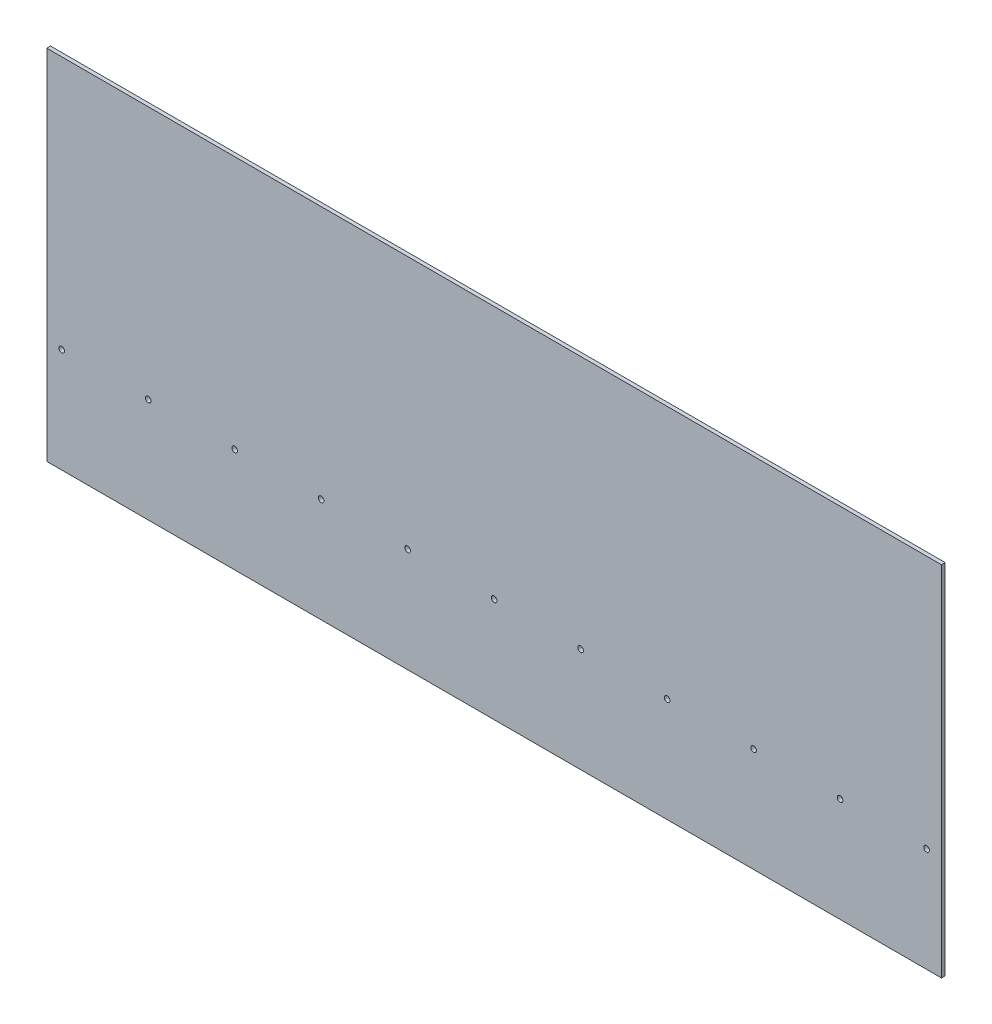
ISO-10303-21;
HEADER;
FILE_DESCRIPTION(('STEP AP214'),'2;1');
FILE_NAME('part.step','',(''),(''),'','','');
FILE_SCHEMA(('AUTOMOTIVE_DESIGN { 1 0 10303 214 1 1 1 1 }'));
ENDSEC;
DATA;
#1=APPLICATION_CONTEXT('core data for automotive mechanical design processes');
#2=APPLICATION_PROTOCOL_DEFINITION('international standard','automotive_design',2000,#1);
#3=PRODUCT_CONTEXT('',#1,'mechanical');
#4=PRODUCT('Part','Part','',(#3));
#5=PRODUCT_RELATED_PRODUCT_CATEGORY('part','',(#4));
#6=PRODUCT_DEFINITION_FORMATION('','',#4);
#7=PRODUCT_DEFINITION_CONTEXT('part definition',#1,'design');
#8=PRODUCT_DEFINITION('design','',#6,#7);
#9=PRODUCT_DEFINITION_SHAPE('','',#8);
#10=(LENGTH_UNIT() NAMED_UNIT(*) SI_UNIT(.MILLI.,.METRE.));
#11=(NAMED_UNIT(*) PLANE_ANGLE_UNIT() SI_UNIT($,.RADIAN.));
#12=(NAMED_UNIT(*) SI_UNIT($,.STERADIAN.) SOLID_ANGLE_UNIT());
#13=UNCERTAINTY_MEASURE_WITH_UNIT(LENGTH_MEASURE(1.E-05),#10,'distance_accuracy_value','');
#14=(GEOMETRIC_REPRESENTATION_CONTEXT(3) GLOBAL_UNCERTAINTY_ASSIGNED_CONTEXT((#13)) GLOBAL_UNIT_ASSIGNED_CONTEXT((#10,
#11,#12)) REPRESENTATION_CONTEXT('',''));
#15=CARTESIAN_POINT('',(0.,0.,0.));
#16=DIRECTION('',(0.,0.,1.));
#17=DIRECTION('',(1.,0.,0.));
#18=AXIS2_PLACEMENT_3D('',#15,#16,#17);
#19=CARTESIAN_POINT('',(381.,152.4,3.175));
#20=DIRECTION('',(-1.,0.,0.));
#21=DIRECTION('',(0.,0.,1.));
#22=AXIS2_PLACEMENT_3D('',#19,#20,#21);
#23=PLANE('',#22);
#24=DIRECTION('',(0.,1.,0.));
#25=VECTOR('',#24,1.);
#26=CARTESIAN_POINT('',(381.,152.4,0.));
#27=LINE('',#26,#25);
#28=CARTESIAN_POINT('',(381.,-152.4,0.));
#29=VERTEX_POINT('',#28);
#30=CARTESIAN_POINT('',(381.,152.4,0.));
#31=VERTEX_POINT('',#30);
#32=EDGE_CURVE('E100',#29,#31,#27,.T.);
#33=ORIENTED_EDGE('',*,*,#32,.T.);
#34=DIRECTION('',(0.,0.,-1.));
#35=VECTOR('',#34,1.);
#36=CARTESIAN_POINT('',(381.,152.4,3.175));
#37=LINE('',#36,#35);
#38=CARTESIAN_POINT('',(381.,152.4,3.175));
#39=VERTEX_POINT('',#38);
#40=EDGE_CURVE('E11',#39,#31,#37,.T.);
#41=ORIENTED_EDGE('',*,*,#40,.F.);
#42=DIRECTION('',(0.,1.,0.));
#43=VECTOR('',#42,1.);
#44=CARTESIAN_POINT('',(381.,152.4,3.175));
#45=LINE('',#44,#43);
#46=CARTESIAN_POINT('',(381.,-152.4,3.175));
#47=VERTEX_POINT('',#46);
#48=EDGE_CURVE('E88',#47,#39,#45,.T.);
#49=ORIENTED_EDGE('',*,*,#48,.F.);
#50=DIRECTION('',(0.,0.,-1.));
#51=VECTOR('',#50,1.);
#52=CARTESIAN_POINT('',(381.,-152.4,3.175));
#53=LINE('',#52,#51);
#54=EDGE_CURVE('E96',#47,#29,#53,.T.);
#55=ORIENTED_EDGE('',*,*,#54,.T.);
#56=EDGE_LOOP('',(#33,#41,#49,#55));
#57=FACE_BOUND('',#56,.T.);
#58=ADVANCED_FACE('F37',(#57),#23,.F.);
#59=CARTESIAN_POINT('',(-381.,152.4,3.175));
#60=DIRECTION('',(0.,-1.,0.));
#61=DIRECTION('',(0.,0.,-1.));
#62=AXIS2_PLACEMENT_3D('',#59,#60,#61);
#63=PLANE('',#62);
#64=DIRECTION('',(-1.,0.,0.));
#65=VECTOR('',#64,1.);
#66=CARTESIAN_POINT('',(-381.,152.4,0.));
#67=LINE('',#66,#65);
#68=CARTESIAN_POINT('',(-381.,152.4,0.));
#69=VERTEX_POINT('',#68);
#70=EDGE_CURVE('E92',#31,#69,#67,.T.);
#71=ORIENTED_EDGE('',*,*,#70,.T.);
#72=DIRECTION('',(0.,0.,-1.));
#73=VECTOR('',#72,1.);
#74=CARTESIAN_POINT('',(-381.,152.4,3.175));
#75=LINE('',#74,#73);
#76=CARTESIAN_POINT('',(-381.,152.4,3.175));
#77=VERTEX_POINT('',#76);
#78=EDGE_CURVE('E45',#77,#69,#75,.T.);
#79=ORIENTED_EDGE('',*,*,#78,.F.);
#80=DIRECTION('',(-1.,0.,0.));
#81=VECTOR('',#80,1.);
#82=CARTESIAN_POINT('',(-381.,152.4,3.175));
#83=LINE('',#82,#81);
#84=EDGE_CURVE('E83',#39,#77,#83,.T.);
#85=ORIENTED_EDGE('',*,*,#84,.F.);
#86=ORIENTED_EDGE('',*,*,#40,.T.);
#87=EDGE_LOOP('',(#71,#79,#85,#86));
#88=FACE_BOUND('',#87,.T.);
#89=ADVANCED_FACE('F91',(#88),#63,.F.);
#90=CARTESIAN_POINT('',(-381.,152.4,3.175));
#91=DIRECTION('',(1.,0.,0.));
#92=DIRECTION('',(0.,0.,-1.));
#93=AXIS2_PLACEMENT_3D('',#90,#91,#92);
#94=PLANE('',#93);
#95=DIRECTION('',(0.,-1.,0.));
#96=VECTOR('',#95,1.);
#97=CARTESIAN_POINT('',(-381.,152.4,0.));
#98=LINE('',#97,#96);
#99=CARTESIAN_POINT('',(-381.,-152.4,0.));
#100=VERTEX_POINT('',#99);
#101=EDGE_CURVE('E70',#69,#100,#98,.T.);
#102=ORIENTED_EDGE('',*,*,#101,.T.);
#103=DIRECTION('',(0.,0.,-1.));
#104=VECTOR('',#103,1.);
#105=CARTESIAN_POINT('',(-381.,-152.4,3.175));
#106=LINE('',#105,#104);
#107=CARTESIAN_POINT('',(-381.,-152.4,3.175));
#108=VERTEX_POINT('',#107);
#109=EDGE_CURVE('E93',#108,#100,#106,.T.);
#110=ORIENTED_EDGE('',*,*,#109,.F.);
#111=DIRECTION('',(0.,-1.,0.));
#112=VECTOR('',#111,1.);
#113=CARTESIAN_POINT('',(-381.,152.4,3.175));
#114=LINE('',#113,#112);
#115=EDGE_CURVE('E86',#77,#108,#114,.T.);
#116=ORIENTED_EDGE('',*,*,#115,.F.);
#117=ORIENTED_EDGE('',*,*,#78,.T.);
#118=EDGE_LOOP('',(#102,#110,#116,#117));
#119=FACE_BOUND('',#118,.T.);
#120=ADVANCED_FACE('F94',(#119),#94,.F.);
#121=CARTESIAN_POINT('',(-381.,-152.4,3.175));
#122=DIRECTION('',(0.,1.,0.));
#123=DIRECTION('',(0.,0.,1.));
#124=AXIS2_PLACEMENT_3D('',#121,#122,#123);
#125=PLANE('',#124);
#126=DIRECTION('',(1.,0.,0.));
#127=VECTOR('',#126,1.);
#128=CARTESIAN_POINT('',(-381.,-152.4,0.));
#129=LINE('',#128,#127);
#130=EDGE_CURVE('E76',#100,#29,#129,.T.);
#131=ORIENTED_EDGE('',*,*,#130,.T.);
#132=ORIENTED_EDGE('',*,*,#54,.F.);
#133=DIRECTION('',(1.,0.,0.));
#134=VECTOR('',#133,1.);
#135=CARTESIAN_POINT('',(-381.,-152.4,3.175));
#136=LINE('',#135,#134);
#137=EDGE_CURVE('E53',#108,#47,#136,.T.);
#138=ORIENTED_EDGE('',*,*,#137,.F.);
#139=ORIENTED_EDGE('',*,*,#109,.T.);
#140=EDGE_LOOP('',(#131,#132,#138,#139));
#141=FACE_BOUND('',#140,.T.);
#142=ADVANCED_FACE('F108',(#141),#125,.F.);
#143=CARTESIAN_POINT('',(0.,0.,3.175));
#144=DIRECTION('',(0.,0.,1.));
#145=DIRECTION('',(1.,0.,0.));
#146=AXIS2_PLACEMENT_3D('',#143,#144,#145);
#147=PLANE('',#146);
#148=CARTESIAN_POINT('',(-368.3,-63.5,3.175));
#149=DIRECTION('',(0.,0.,1.));
#150=DIRECTION('',(1.,0.,0.));
#151=AXIS2_PLACEMENT_3D('',#148,#149,#150);
#152=CIRCLE('',#151,2.41299999999999);
#153=CARTESIAN_POINT('',(-365.887,-63.5,3.175));
#154=VERTEX_POINT('',#153);
#155=EDGE_CURVE('E174',#154,#154,#152,.T.);
#156=ORIENTED_EDGE('',*,*,#155,.F.);
#157=EDGE_LOOP('',(#156));
#158=FACE_BOUND('',#157,.T.);
#159=CARTESIAN_POINT('',(-294.64,-63.5,3.175));
#160=DIRECTION('',(0.,0.,1.));
#161=DIRECTION('',(1.,0.,0.));
#162=AXIS2_PLACEMENT_3D('',#159,#160,#161);
#163=CIRCLE('',#162,2.41299999999999);
#164=CARTESIAN_POINT('',(-292.227,-63.5,3.175));
#165=VERTEX_POINT('',#164);
#166=EDGE_CURVE('E171',#165,#165,#163,.T.);
#167=ORIENTED_EDGE('',*,*,#166,.F.);
#168=EDGE_LOOP('',(#167));
#169=FACE_BOUND('',#168,.T.);
#170=CARTESIAN_POINT('',(-220.98,-63.5,3.175));
#171=DIRECTION('',(0.,0.,1.));
#172=DIRECTION('',(1.,0.,0.));
#173=AXIS2_PLACEMENT_3D('',#170,#171,#172);
#174=CIRCLE('',#173,2.41299999999999);
#175=CARTESIAN_POINT('',(-218.567,-63.5,3.175));
#176=VERTEX_POINT('',#175);
#177=EDGE_CURVE('E165',#176,#176,#174,.T.);
#178=ORIENTED_EDGE('',*,*,#177,.F.);
#179=EDGE_LOOP('',(#178));
#180=FACE_BOUND('',#179,.T.);
#181=CARTESIAN_POINT('',(-147.32,-63.5,3.175));
#182=DIRECTION('',(0.,0.,1.));
#183=DIRECTION('',(1.,0.,0.));
#184=AXIS2_PLACEMENT_3D('',#181,#182,#183);
#185=CIRCLE('',#184,2.41299999999999);
#186=CARTESIAN_POINT('',(-144.907,-63.5,3.175));
#187=VERTEX_POINT('',#186);
#188=EDGE_CURVE('E159',#187,#187,#185,.T.);
#189=ORIENTED_EDGE('',*,*,#188,.F.);
#190=EDGE_LOOP('',(#189));
#191=FACE_BOUND('',#190,.T.);
#192=CARTESIAN_POINT('',(-73.6600000000001,-63.5,3.175));
#193=DIRECTION('',(0.,0.,1.));
#194=DIRECTION('',(1.,0.,0.));
#195=AXIS2_PLACEMENT_3D('',#192,#193,#194);
#196=CIRCLE('',#195,2.41299999999999);
#197=CARTESIAN_POINT('',(-71.2470000000001,-63.5,3.175));
#198=VERTEX_POINT('',#197);
#199=EDGE_CURVE('E153',#198,#198,#196,.T.);
#200=ORIENTED_EDGE('',*,*,#199,.F.);
#201=EDGE_LOOP('',(#200));
#202=FACE_BOUND('',#201,.T.);
#203=CARTESIAN_POINT('',(0.,-63.5,3.175));
#204=DIRECTION('',(0.,0.,1.));
#205=DIRECTION('',(1.,0.,0.));
#206=AXIS2_PLACEMENT_3D('',#203,#204,#205);
#207=CIRCLE('',#206,2.41299999999999);
#208=CARTESIAN_POINT('',(2.41299999999994,-63.5,3.175));
#209=VERTEX_POINT('',#208);
#210=EDGE_CURVE('E147',#209,#209,#207,.T.);
#211=ORIENTED_EDGE('',*,*,#210,.F.);
#212=EDGE_LOOP('',(#211));
#213=FACE_BOUND('',#212,.T.);
#214=CARTESIAN_POINT('',(73.6599999999999,-63.5,3.175));
#215=DIRECTION('',(0.,0.,1.));
#216=DIRECTION('',(1.,0.,0.));
#217=AXIS2_PLACEMENT_3D('',#214,#215,#216);
#218=CIRCLE('',#217,2.41299999999999);
#219=CARTESIAN_POINT('',(76.0729999999999,-63.5,3.175));
#220=VERTEX_POINT('',#219);
#221=EDGE_CURVE('E141',#220,#220,#218,.T.);
#222=ORIENTED_EDGE('',*,*,#221,.F.);
#223=EDGE_LOOP('',(#222));
#224=FACE_BOUND('',#223,.T.);
#225=CARTESIAN_POINT('',(147.32,-63.5,3.175));
#226=DIRECTION('',(0.,0.,1.));
#227=DIRECTION('',(1.,0.,0.));
#228=AXIS2_PLACEMENT_3D('',#225,#226,#227);
#229=CIRCLE('',#228,2.41299999999999);
#230=CARTESIAN_POINT('',(149.733,-63.5,3.175));
#231=VERTEX_POINT('',#230);
#232=EDGE_CURVE('E135',#231,#231,#229,.T.);
#233=ORIENTED_EDGE('',*,*,#232,.F.);
#234=EDGE_LOOP('',(#233));
#235=FACE_BOUND('',#234,.T.);
#236=CARTESIAN_POINT('',(220.98,-63.5,3.175));
#237=DIRECTION('',(0.,0.,1.));
#238=DIRECTION('',(1.,0.,0.));
#239=AXIS2_PLACEMENT_3D('',#236,#237,#238);
#240=CIRCLE('',#239,2.41299999999999);
#241=CARTESIAN_POINT('',(223.393,-63.5,3.175));
#242=VERTEX_POINT('',#241);
#243=EDGE_CURVE('E129',#242,#242,#240,.T.);
#244=ORIENTED_EDGE('',*,*,#243,.F.);
#245=EDGE_LOOP('',(#244));
#246=FACE_BOUND('',#245,.T.);
#247=CARTESIAN_POINT('',(294.64,-63.5,3.175));
#248=DIRECTION('',(0.,0.,1.));
#249=DIRECTION('',(1.,0.,0.));
#250=AXIS2_PLACEMENT_3D('',#247,#248,#249);
#251=CIRCLE('',#250,2.41299999999999);
#252=CARTESIAN_POINT('',(297.053,-63.5,3.175));
#253=VERTEX_POINT('',#252);
#254=EDGE_CURVE('E123',#253,#253,#251,.T.);
#255=ORIENTED_EDGE('',*,*,#254,.F.);
#256=EDGE_LOOP('',(#255));
#257=FACE_BOUND('',#256,.T.);
#258=CARTESIAN_POINT('',(368.3,-63.5,3.175));
#259=DIRECTION('',(0.,0.,1.));
#260=DIRECTION('',(1.,0.,0.));
#261=AXIS2_PLACEMENT_3D('',#258,#259,#260);
#262=CIRCLE('',#261,2.41299999999999);
#263=CARTESIAN_POINT('',(370.713,-63.5,3.175));
#264=VERTEX_POINT('',#263);
#265=EDGE_CURVE('E117',#264,#264,#262,.T.);
#266=ORIENTED_EDGE('',*,*,#265,.F.);
#267=EDGE_LOOP('',(#266));
#268=FACE_BOUND('',#267,.T.);
#269=ORIENTED_EDGE('',*,*,#48,.T.);
#270=ORIENTED_EDGE('',*,*,#84,.T.);
#271=ORIENTED_EDGE('',*,*,#115,.T.);
#272=ORIENTED_EDGE('',*,*,#137,.T.);
#273=EDGE_LOOP('',(#269,#270,#271,#272));
#274=FACE_BOUND('',#273,.T.);
#275=ADVANCED_FACE('F84',(#158,#169,#180,#191,#202,#213,#224,#235,#246,#257,#268,#274),#147,.T.);
#276=CARTESIAN_POINT('',(0.,0.,0.));
#277=DIRECTION('',(0.,0.,1.));
#278=DIRECTION('',(1.,0.,0.));
#279=AXIS2_PLACEMENT_3D('',#276,#277,#278);
#280=PLANE('',#279);
#281=CARTESIAN_POINT('',(-368.3,-63.5,0.));
#282=DIRECTION('',(0.,0.,1.));
#283=DIRECTION('',(1.,0.,0.));
#284=AXIS2_PLACEMENT_3D('',#281,#282,#283);
#285=CIRCLE('',#284,2.41299999999999);
#286=CARTESIAN_POINT('',(-365.887,-63.5,0.));
#287=VERTEX_POINT('',#286);
#288=EDGE_CURVE('E103',#287,#287,#285,.T.);
#289=ORIENTED_EDGE('',*,*,#288,.T.);
#290=EDGE_LOOP('',(#289));
#291=FACE_BOUND('',#290,.T.);
#292=CARTESIAN_POINT('',(-294.64,-63.5,0.));
#293=DIRECTION('',(0.,0.,1.));
#294=DIRECTION('',(1.,0.,0.));
#295=AXIS2_PLACEMENT_3D('',#292,#293,#294);
#296=CIRCLE('',#295,2.41299999999999);
#297=CARTESIAN_POINT('',(-292.227,-63.5,0.));
#298=VERTEX_POINT('',#297);
#299=EDGE_CURVE('E168',#298,#298,#296,.T.);
#300=ORIENTED_EDGE('',*,*,#299,.T.);
#301=EDGE_LOOP('',(#300));
#302=FACE_BOUND('',#301,.T.);
#303=CARTESIAN_POINT('',(-220.98,-63.5,0.));
#304=DIRECTION('',(0.,0.,1.));
#305=DIRECTION('',(1.,0.,0.));
#306=AXIS2_PLACEMENT_3D('',#303,#304,#305);
#307=CIRCLE('',#306,2.41299999999999);
#308=CARTESIAN_POINT('',(-218.567,-63.5,0.));
#309=VERTEX_POINT('',#308);
#310=EDGE_CURVE('E162',#309,#309,#307,.T.);
#311=ORIENTED_EDGE('',*,*,#310,.T.);
#312=EDGE_LOOP('',(#311));
#313=FACE_BOUND('',#312,.T.);
#314=CARTESIAN_POINT('',(-147.32,-63.5,0.));
#315=DIRECTION('',(0.,0.,1.));
#316=DIRECTION('',(1.,0.,0.));
#317=AXIS2_PLACEMENT_3D('',#314,#315,#316);
#318=CIRCLE('',#317,2.41299999999999);
#319=CARTESIAN_POINT('',(-144.907,-63.5,0.));
#320=VERTEX_POINT('',#319);
#321=EDGE_CURVE('E156',#320,#320,#318,.T.);
#322=ORIENTED_EDGE('',*,*,#321,.T.);
#323=EDGE_LOOP('',(#322));
#324=FACE_BOUND('',#323,.T.);
#325=CARTESIAN_POINT('',(-73.6600000000001,-63.5,0.));
#326=DIRECTION('',(0.,0.,1.));
#327=DIRECTION('',(1.,0.,0.));
#328=AXIS2_PLACEMENT_3D('',#325,#326,#327);
#329=CIRCLE('',#328,2.41299999999999);
#330=CARTESIAN_POINT('',(-71.2470000000001,-63.5,0.));
#331=VERTEX_POINT('',#330);
#332=EDGE_CURVE('E150',#331,#331,#329,.T.);
#333=ORIENTED_EDGE('',*,*,#332,.T.);
#334=EDGE_LOOP('',(#333));
#335=FACE_BOUND('',#334,.T.);
#336=CARTESIAN_POINT('',(0.,-63.5,0.));
#337=DIRECTION('',(0.,0.,1.));
#338=DIRECTION('',(1.,0.,0.));
#339=AXIS2_PLACEMENT_3D('',#336,#337,#338);
#340=CIRCLE('',#339,2.41299999999999);
#341=CARTESIAN_POINT('',(2.41299999999994,-63.5,0.));
#342=VERTEX_POINT('',#341);
#343=EDGE_CURVE('E144',#342,#342,#340,.T.);
#344=ORIENTED_EDGE('',*,*,#343,.T.);
#345=EDGE_LOOP('',(#344));
#346=FACE_BOUND('',#345,.T.);
#347=CARTESIAN_POINT('',(73.6599999999999,-63.5,0.));
#348=DIRECTION('',(0.,0.,1.));
#349=DIRECTION('',(1.,0.,0.));
#350=AXIS2_PLACEMENT_3D('',#347,#348,#349);
#351=CIRCLE('',#350,2.41299999999999);
#352=CARTESIAN_POINT('',(76.0729999999999,-63.5,0.));
#353=VERTEX_POINT('',#352);
#354=EDGE_CURVE('E138',#353,#353,#351,.T.);
#355=ORIENTED_EDGE('',*,*,#354,.T.);
#356=EDGE_LOOP('',(#355));
#357=FACE_BOUND('',#356,.T.);
#358=CARTESIAN_POINT('',(147.32,-63.5,0.));
#359=DIRECTION('',(0.,0.,1.));
#360=DIRECTION('',(1.,0.,0.));
#361=AXIS2_PLACEMENT_3D('',#358,#359,#360);
#362=CIRCLE('',#361,2.41299999999999);
#363=CARTESIAN_POINT('',(149.733,-63.5,0.));
#364=VERTEX_POINT('',#363);
#365=EDGE_CURVE('E132',#364,#364,#362,.T.);
#366=ORIENTED_EDGE('',*,*,#365,.T.);
#367=EDGE_LOOP('',(#366));
#368=FACE_BOUND('',#367,.T.);
#369=CARTESIAN_POINT('',(220.98,-63.5,0.));
#370=DIRECTION('',(0.,0.,1.));
#371=DIRECTION('',(1.,0.,0.));
#372=AXIS2_PLACEMENT_3D('',#369,#370,#371);
#373=CIRCLE('',#372,2.41299999999999);
#374=CARTESIAN_POINT('',(223.393,-63.5,0.));
#375=VERTEX_POINT('',#374);
#376=EDGE_CURVE('E126',#375,#375,#373,.T.);
#377=ORIENTED_EDGE('',*,*,#376,.T.);
#378=EDGE_LOOP('',(#377));
#379=FACE_BOUND('',#378,.T.);
#380=CARTESIAN_POINT('',(294.64,-63.5,0.));
#381=DIRECTION('',(0.,0.,1.));
#382=DIRECTION('',(1.,0.,0.));
#383=AXIS2_PLACEMENT_3D('',#380,#381,#382);
#384=CIRCLE('',#383,2.41299999999999);
#385=CARTESIAN_POINT('',(297.053,-63.5,0.));
#386=VERTEX_POINT('',#385);
#387=EDGE_CURVE('E120',#386,#386,#384,.T.);
#388=ORIENTED_EDGE('',*,*,#387,.T.);
#389=EDGE_LOOP('',(#388));
#390=FACE_BOUND('',#389,.T.);
#391=CARTESIAN_POINT('',(368.3,-63.5,0.));
#392=DIRECTION('',(0.,0.,1.));
#393=DIRECTION('',(1.,0.,0.));
#394=AXIS2_PLACEMENT_3D('',#391,#392,#393);
#395=CIRCLE('',#394,2.41299999999999);
#396=CARTESIAN_POINT('',(370.713,-63.5,0.));
#397=VERTEX_POINT('',#396);
#398=EDGE_CURVE('E114',#397,#397,#395,.T.);
#399=ORIENTED_EDGE('',*,*,#398,.T.);
#400=EDGE_LOOP('',(#399));
#401=FACE_BOUND('',#400,.T.);
#402=ORIENTED_EDGE('',*,*,#32,.F.);
#403=ORIENTED_EDGE('',*,*,#130,.F.);
#404=ORIENTED_EDGE('',*,*,#101,.F.);
#405=ORIENTED_EDGE('',*,*,#70,.F.);
#406=EDGE_LOOP('',(#402,#403,#404,#405));
#407=FACE_BOUND('',#406,.T.);
#408=ADVANCED_FACE('F111',(#291,#302,#313,#324,#335,#346,#357,#368,#379,#390,#401,#407),#280,.F.);
#409=CARTESIAN_POINT('',(368.3,-63.5,0.));
#410=DIRECTION('',(0.,0.,1.));
#411=DIRECTION('',(1.,0.,0.));
#412=AXIS2_PLACEMENT_3D('',#409,#410,#411);
#413=CYLINDRICAL_SURFACE('',#412,2.41299999999999);
#414=ORIENTED_EDGE('',*,*,#398,.F.);
#415=EDGE_LOOP('',(#414));
#416=FACE_BOUND('',#415,.T.);
#417=ORIENTED_EDGE('',*,*,#265,.T.);
#418=EDGE_LOOP('',(#417));
#419=FACE_BOUND('',#418,.T.);
#420=ADVANCED_FACE('F212',(#416,#419),#413,.F.);
#421=CARTESIAN_POINT('',(294.64,-63.5,0.));
#422=DIRECTION('',(0.,0.,1.));
#423=DIRECTION('',(1.,0.,0.));
#424=AXIS2_PLACEMENT_3D('',#421,#422,#423);
#425=CYLINDRICAL_SURFACE('',#424,2.41299999999999);
#426=ORIENTED_EDGE('',*,*,#387,.F.);
#427=EDGE_LOOP('',(#426));
#428=FACE_BOUND('',#427,.T.);
#429=ORIENTED_EDGE('',*,*,#254,.T.);
#430=EDGE_LOOP('',(#429));
#431=FACE_BOUND('',#430,.T.);
#432=ADVANCED_FACE('F214',(#428,#431),#425,.F.);
#433=CARTESIAN_POINT('',(220.98,-63.5,0.));
#434=DIRECTION('',(0.,0.,1.));
#435=DIRECTION('',(1.,0.,0.));
#436=AXIS2_PLACEMENT_3D('',#433,#434,#435);
#437=CYLINDRICAL_SURFACE('',#436,2.41299999999999);
#438=ORIENTED_EDGE('',*,*,#376,.F.);
#439=EDGE_LOOP('',(#438));
#440=FACE_BOUND('',#439,.T.);
#441=ORIENTED_EDGE('',*,*,#243,.T.);
#442=EDGE_LOOP('',(#441));
#443=FACE_BOUND('',#442,.T.);
#444=ADVANCED_FACE('F221',(#440,#443),#437,.F.);
#445=CARTESIAN_POINT('',(147.32,-63.5,0.));
#446=DIRECTION('',(0.,0.,1.));
#447=DIRECTION('',(1.,0.,0.));
#448=AXIS2_PLACEMENT_3D('',#445,#446,#447);
#449=CYLINDRICAL_SURFACE('',#448,2.41299999999999);
#450=ORIENTED_EDGE('',*,*,#365,.F.);
#451=EDGE_LOOP('',(#450));
#452=FACE_BOUND('',#451,.T.);
#453=ORIENTED_EDGE('',*,*,#232,.T.);
#454=EDGE_LOOP('',(#453));
#455=FACE_BOUND('',#454,.T.);
#456=ADVANCED_FACE('F273',(#452,#455),#449,.F.);
#457=CARTESIAN_POINT('',(73.6599999999999,-63.5,0.));
#458=DIRECTION('',(0.,0.,1.));
#459=DIRECTION('',(1.,0.,0.));
#460=AXIS2_PLACEMENT_3D('',#457,#458,#459);
#461=CYLINDRICAL_SURFACE('',#460,2.41299999999999);
#462=ORIENTED_EDGE('',*,*,#354,.F.);
#463=EDGE_LOOP('',(#462));
#464=FACE_BOUND('',#463,.T.);
#465=ORIENTED_EDGE('',*,*,#221,.T.);
#466=EDGE_LOOP('',(#465));
#467=FACE_BOUND('',#466,.T.);
#468=ADVANCED_FACE('F284',(#464,#467),#461,.F.);
#469=CARTESIAN_POINT('',(0.,-63.5,0.));
#470=DIRECTION('',(0.,0.,1.));
#471=DIRECTION('',(1.,0.,0.));
#472=AXIS2_PLACEMENT_3D('',#469,#470,#471);
#473=CYLINDRICAL_SURFACE('',#472,2.41299999999999);
#474=ORIENTED_EDGE('',*,*,#343,.F.);
#475=EDGE_LOOP('',(#474));
#476=FACE_BOUND('',#475,.T.);
#477=ORIENTED_EDGE('',*,*,#210,.T.);
#478=EDGE_LOOP('',(#477));
#479=FACE_BOUND('',#478,.T.);
#480=ADVANCED_FACE('F295',(#476,#479),#473,.F.);
#481=CARTESIAN_POINT('',(-73.6600000000001,-63.5,0.));
#482=DIRECTION('',(0.,0.,1.));
#483=DIRECTION('',(1.,0.,0.));
#484=AXIS2_PLACEMENT_3D('',#481,#482,#483);
#485=CYLINDRICAL_SURFACE('',#484,2.41299999999999);
#486=ORIENTED_EDGE('',*,*,#332,.F.);
#487=EDGE_LOOP('',(#486));
#488=FACE_BOUND('',#487,.T.);
#489=ORIENTED_EDGE('',*,*,#199,.T.);
#490=EDGE_LOOP('',(#489));
#491=FACE_BOUND('',#490,.T.);
#492=ADVANCED_FACE('F306',(#488,#491),#485,.F.);
#493=CARTESIAN_POINT('',(-147.32,-63.5,0.));
#494=DIRECTION('',(0.,0.,1.));
#495=DIRECTION('',(1.,0.,0.));
#496=AXIS2_PLACEMENT_3D('',#493,#494,#495);
#497=CYLINDRICAL_SURFACE('',#496,2.41299999999999);
#498=ORIENTED_EDGE('',*,*,#321,.F.);
#499=EDGE_LOOP('',(#498));
#500=FACE_BOUND('',#499,.T.);
#501=ORIENTED_EDGE('',*,*,#188,.T.);
#502=EDGE_LOOP('',(#501));
#503=FACE_BOUND('',#502,.T.);
#504=ADVANCED_FACE('F317',(#500,#503),#497,.F.);
#505=CARTESIAN_POINT('',(-220.98,-63.5,0.));
#506=DIRECTION('',(0.,0.,1.));
#507=DIRECTION('',(1.,0.,0.));
#508=AXIS2_PLACEMENT_3D('',#505,#506,#507);
#509=CYLINDRICAL_SURFACE('',#508,2.41299999999999);
#510=ORIENTED_EDGE('',*,*,#310,.F.);
#511=EDGE_LOOP('',(#510));
#512=FACE_BOUND('',#511,.T.);
#513=ORIENTED_EDGE('',*,*,#177,.T.);
#514=EDGE_LOOP('',(#513));
#515=FACE_BOUND('',#514,.T.);
#516=ADVANCED_FACE('F328',(#512,#515),#509,.F.);
#517=CARTESIAN_POINT('',(-294.64,-63.5,0.));
#518=DIRECTION('',(0.,0.,1.));
#519=DIRECTION('',(1.,0.,0.));
#520=AXIS2_PLACEMENT_3D('',#517,#518,#519);
#521=CYLINDRICAL_SURFACE('',#520,2.41299999999999);
#522=ORIENTED_EDGE('',*,*,#299,.F.);
#523=EDGE_LOOP('',(#522));
#524=FACE_BOUND('',#523,.T.);
#525=ORIENTED_EDGE('',*,*,#166,.T.);
#526=EDGE_LOOP('',(#525));
#527=FACE_BOUND('',#526,.T.);
#528=ADVANCED_FACE('F185',(#524,#527),#521,.F.);
#529=CARTESIAN_POINT('',(-368.3,-63.5,0.));
#530=DIRECTION('',(0.,0.,1.));
#531=DIRECTION('',(1.,0.,0.));
#532=AXIS2_PLACEMENT_3D('',#529,#530,#531);
#533=CYLINDRICAL_SURFACE('',#532,2.41299999999999);
#534=ORIENTED_EDGE('',*,*,#288,.F.);
#535=EDGE_LOOP('',(#534));
#536=FACE_BOUND('',#535,.T.);
#537=ORIENTED_EDGE('',*,*,#155,.T.);
#538=EDGE_LOOP('',(#537));
#539=FACE_BOUND('',#538,.T.);
#540=ADVANCED_FACE('F182',(#536,#539),#533,.F.);
#541=CLOSED_SHELL('',(#58,#89,#120,#142,#275,#408,#420,#432,#444,#456,#468,#480,#492,#504,#516,
#528,#540));
#542=MANIFOLD_SOLID_BREP('B2',#541);
#543=ADVANCED_BREP_SHAPE_REPRESENTATION('',(#18,#542),#14);
#544=SHAPE_DEFINITION_REPRESENTATION(#9,#543);
ENDSEC;
END-ISO-10303-21;
